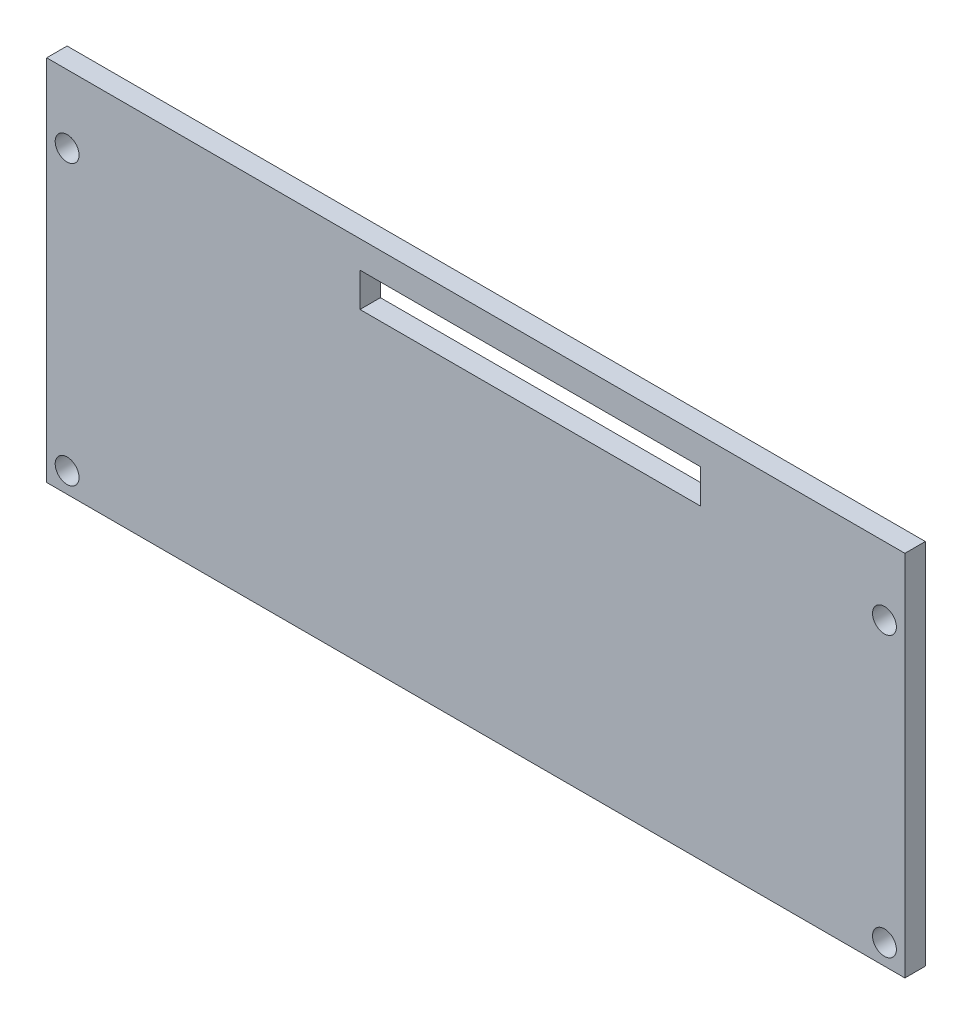
ISO-10303-21;
HEADER;
FILE_DESCRIPTION(('STEP AP214'),'2;1');
FILE_NAME('part.step','',(''),(''),'','','');
FILE_SCHEMA(('AUTOMOTIVE_DESIGN { 1 0 10303 214 1 1 1 1 }'));
ENDSEC;
DATA;
#1=APPLICATION_CONTEXT('core data for automotive mechanical design processes');
#2=APPLICATION_PROTOCOL_DEFINITION('international standard','automotive_design',2000,#1);
#3=PRODUCT_CONTEXT('',#1,'mechanical');
#4=PRODUCT('Part','Part','',(#3));
#5=PRODUCT_RELATED_PRODUCT_CATEGORY('part','',(#4));
#6=PRODUCT_DEFINITION_FORMATION('','',#4);
#7=PRODUCT_DEFINITION_CONTEXT('part definition',#1,'design');
#8=PRODUCT_DEFINITION('design','',#6,#7);
#9=PRODUCT_DEFINITION_SHAPE('','',#8);
#10=(LENGTH_UNIT() NAMED_UNIT(*) SI_UNIT(.MILLI.,.METRE.));
#11=(NAMED_UNIT(*) PLANE_ANGLE_UNIT() SI_UNIT($,.RADIAN.));
#12=(NAMED_UNIT(*) SI_UNIT($,.STERADIAN.) SOLID_ANGLE_UNIT());
#13=UNCERTAINTY_MEASURE_WITH_UNIT(LENGTH_MEASURE(1.E-05),#10,'distance_accuracy_value','');
#14=(GEOMETRIC_REPRESENTATION_CONTEXT(3) GLOBAL_UNCERTAINTY_ASSIGNED_CONTEXT((#13)) GLOBAL_UNIT_ASSIGNED_CONTEXT((#10,
#11,#12)) REPRESENTATION_CONTEXT('',''));
#15=CARTESIAN_POINT('',(0.,0.,0.));
#16=DIRECTION('',(0.,0.,1.));
#17=DIRECTION('',(1.,0.,0.));
#18=AXIS2_PLACEMENT_3D('',#15,#16,#17);
#19=CARTESIAN_POINT('',(0.,21.,3.));
#20=DIRECTION('',(0.,1.,0.));
#21=DIRECTION('',(0.,0.,1.));
#22=AXIS2_PLACEMENT_3D('',#19,#20,#21);
#23=PLANE('',#22);
#24=DIRECTION('',(1.,0.,0.));
#25=VECTOR('',#24,1.);
#26=CARTESIAN_POINT('',(0.,21.,0.));
#27=LINE('',#26,#25);
#28=CARTESIAN_POINT('',(-17.,21.,0.));
#29=VERTEX_POINT('',#28);
#30=CARTESIAN_POINT('',(33.,21.,0.));
#31=VERTEX_POINT('',#30);
#32=EDGE_CURVE('E180',#29,#31,#27,.T.);
#33=ORIENTED_EDGE('',*,*,#32,.T.);
#34=DIRECTION('',(0.,0.,-1.));
#35=VECTOR('',#34,1.);
#36=CARTESIAN_POINT('',(33.,21.,3.));
#37=LINE('',#36,#35);
#38=CARTESIAN_POINT('',(33.,21.,3.));
#39=VERTEX_POINT('',#38);
#40=EDGE_CURVE('E11',#39,#31,#37,.T.);
#41=ORIENTED_EDGE('',*,*,#40,.F.);
#42=DIRECTION('',(1.,0.,0.));
#43=VECTOR('',#42,1.);
#44=CARTESIAN_POINT('',(0.,21.,3.));
#45=LINE('',#44,#43);
#46=CARTESIAN_POINT('',(-17.,21.,3.));
#47=VERTEX_POINT('',#46);
#48=EDGE_CURVE('E127',#47,#39,#45,.T.);
#49=ORIENTED_EDGE('',*,*,#48,.F.);
#50=DIRECTION('',(0.,0.,-1.));
#51=VECTOR('',#50,1.);
#52=CARTESIAN_POINT('',(-17.,21.,3.));
#53=LINE('',#52,#51);
#54=EDGE_CURVE('E67',#47,#29,#53,.T.);
#55=ORIENTED_EDGE('',*,*,#54,.T.);
#56=EDGE_LOOP('',(#33,#41,#49,#55));
#57=FACE_BOUND('',#56,.T.);
#58=ADVANCED_FACE('F47',(#57),#23,.F.);
#59=CARTESIAN_POINT('',(33.,0.,3.));
#60=DIRECTION('',(1.,0.,0.));
#61=DIRECTION('',(0.,0.,-1.));
#62=AXIS2_PLACEMENT_3D('',#59,#60,#61);
#63=PLANE('',#62);
#64=DIRECTION('',(0.,-1.,0.));
#65=VECTOR('',#64,1.);
#66=CARTESIAN_POINT('',(33.,0.,0.));
#67=LINE('',#66,#65);
#68=CARTESIAN_POINT('',(33.,16.,0.));
#69=VERTEX_POINT('',#68);
#70=EDGE_CURVE('E134',#31,#69,#67,.T.);
#71=ORIENTED_EDGE('',*,*,#70,.T.);
#72=DIRECTION('',(0.,0.,-1.));
#73=VECTOR('',#72,1.);
#74=CARTESIAN_POINT('',(33.,16.,3.));
#75=LINE('',#74,#73);
#76=CARTESIAN_POINT('',(33.,16.,3.));
#77=VERTEX_POINT('',#76);
#78=EDGE_CURVE('E58',#77,#69,#75,.T.);
#79=ORIENTED_EDGE('',*,*,#78,.F.);
#80=DIRECTION('',(0.,-1.,0.));
#81=VECTOR('',#80,1.);
#82=CARTESIAN_POINT('',(33.,0.,3.));
#83=LINE('',#82,#81);
#84=EDGE_CURVE('E121',#39,#77,#83,.T.);
#85=ORIENTED_EDGE('',*,*,#84,.F.);
#86=ORIENTED_EDGE('',*,*,#40,.T.);
#87=EDGE_LOOP('',(#71,#79,#85,#86));
#88=FACE_BOUND('',#87,.T.);
#89=ADVANCED_FACE('F133',(#88),#63,.F.);
#90=CARTESIAN_POINT('',(0.,16.,3.));
#91=DIRECTION('',(0.,1.,0.));
#92=DIRECTION('',(0.,0.,1.));
#93=AXIS2_PLACEMENT_3D('',#90,#91,#92);
#94=PLANE('',#93);
#95=DIRECTION('',(1.,0.,0.));
#96=VECTOR('',#95,1.);
#97=CARTESIAN_POINT('',(0.,16.,0.));
#98=LINE('',#97,#96);
#99=CARTESIAN_POINT('',(-17.,16.,0.));
#100=VERTEX_POINT('',#99);
#101=EDGE_CURVE('E185',#100,#69,#98,.T.);
#102=ORIENTED_EDGE('',*,*,#101,.F.);
#103=DIRECTION('',(0.,0.,-1.));
#104=VECTOR('',#103,1.);
#105=CARTESIAN_POINT('',(-17.,16.,3.));
#106=LINE('',#105,#104);
#107=CARTESIAN_POINT('',(-17.,16.,3.));
#108=VERTEX_POINT('',#107);
#109=EDGE_CURVE('E93',#108,#100,#106,.T.);
#110=ORIENTED_EDGE('',*,*,#109,.F.);
#111=DIRECTION('',(1.,0.,0.));
#112=VECTOR('',#111,1.);
#113=CARTESIAN_POINT('',(0.,16.,3.));
#114=LINE('',#113,#112);
#115=EDGE_CURVE('E126',#108,#77,#114,.T.);
#116=ORIENTED_EDGE('',*,*,#115,.T.);
#117=ORIENTED_EDGE('',*,*,#78,.T.);
#118=EDGE_LOOP('',(#102,#110,#116,#117));
#119=FACE_BOUND('',#118,.T.);
#120=ADVANCED_FACE('F139',(#119),#94,.T.);
#121=CARTESIAN_POINT('',(63.,0.,3.));
#122=DIRECTION('',(1.,0.,0.));
#123=DIRECTION('',(0.,0.,-1.));
#124=AXIS2_PLACEMENT_3D('',#121,#122,#123);
#125=PLANE('',#124);
#126=DIRECTION('',(0.,-1.,0.));
#127=VECTOR('',#126,1.);
#128=CARTESIAN_POINT('',(63.,0.,0.));
#129=LINE('',#128,#127);
#130=CARTESIAN_POINT('',(63.,25.,0.));
#131=VERTEX_POINT('',#130);
#132=CARTESIAN_POINT('',(63.,-29.,0.));
#133=VERTEX_POINT('',#132);
#134=EDGE_CURVE('E164',#131,#133,#129,.T.);
#135=ORIENTED_EDGE('',*,*,#134,.F.);
#136=DIRECTION('',(0.,0.,-1.));
#137=VECTOR('',#136,1.);
#138=CARTESIAN_POINT('',(63.,25.,3.));
#139=LINE('',#138,#137);
#140=CARTESIAN_POINT('',(63.,25.,3.));
#141=VERTEX_POINT('',#140);
#142=EDGE_CURVE('E51',#141,#131,#139,.T.);
#143=ORIENTED_EDGE('',*,*,#142,.F.);
#144=DIRECTION('',(0.,-1.,0.));
#145=VECTOR('',#144,1.);
#146=CARTESIAN_POINT('',(63.,0.,3.));
#147=LINE('',#146,#145);
#148=CARTESIAN_POINT('',(63.,-29.,3.));
#149=VERTEX_POINT('',#148);
#150=EDGE_CURVE('E232',#141,#149,#147,.T.);
#151=ORIENTED_EDGE('',*,*,#150,.T.);
#152=DIRECTION('',(0.,0.,-1.));
#153=VECTOR('',#152,1.);
#154=CARTESIAN_POINT('',(63.,-29.,3.));
#155=LINE('',#154,#153);
#156=EDGE_CURVE('E144',#149,#133,#155,.T.);
#157=ORIENTED_EDGE('',*,*,#156,.T.);
#158=EDGE_LOOP('',(#135,#143,#151,#157));
#159=FACE_BOUND('',#158,.T.);
#160=ADVANCED_FACE('F214',(#159),#125,.T.);
#161=CARTESIAN_POINT('',(0.,25.,3.));
#162=DIRECTION('',(0.,1.,0.));
#163=DIRECTION('',(0.,0.,1.));
#164=AXIS2_PLACEMENT_3D('',#161,#162,#163);
#165=PLANE('',#164);
#166=DIRECTION('',(1.,0.,0.));
#167=VECTOR('',#166,1.);
#168=CARTESIAN_POINT('',(0.,25.,0.));
#169=LINE('',#168,#167);
#170=CARTESIAN_POINT('',(-63.,25.,0.));
#171=VERTEX_POINT('',#170);
#172=EDGE_CURVE('E168',#171,#131,#169,.T.);
#173=ORIENTED_EDGE('',*,*,#172,.F.);
#174=DIRECTION('',(0.,0.,-1.));
#175=VECTOR('',#174,1.);
#176=CARTESIAN_POINT('',(-63.,25.,3.));
#177=LINE('',#176,#175);
#178=CARTESIAN_POINT('',(-63.,25.,3.));
#179=VERTEX_POINT('',#178);
#180=EDGE_CURVE('E202',#179,#171,#177,.T.);
#181=ORIENTED_EDGE('',*,*,#180,.F.);
#182=DIRECTION('',(1.,0.,0.));
#183=VECTOR('',#182,1.);
#184=CARTESIAN_POINT('',(0.,25.,3.));
#185=LINE('',#184,#183);
#186=EDGE_CURVE('E213',#179,#141,#185,.T.);
#187=ORIENTED_EDGE('',*,*,#186,.T.);
#188=ORIENTED_EDGE('',*,*,#142,.T.);
#189=EDGE_LOOP('',(#173,#181,#187,#188));
#190=FACE_BOUND('',#189,.T.);
#191=ADVANCED_FACE('F211',(#190),#165,.T.);
#192=CARTESIAN_POINT('',(-63.,0.,3.));
#193=DIRECTION('',(1.,0.,0.));
#194=DIRECTION('',(0.,0.,-1.));
#195=AXIS2_PLACEMENT_3D('',#192,#193,#194);
#196=PLANE('',#195);
#197=DIRECTION('',(0.,-1.,0.));
#198=VECTOR('',#197,1.);
#199=CARTESIAN_POINT('',(-63.,0.,0.));
#200=LINE('',#199,#198);
#201=CARTESIAN_POINT('',(-63.,-29.,0.));
#202=VERTEX_POINT('',#201);
#203=EDGE_CURVE('E172',#171,#202,#200,.T.);
#204=ORIENTED_EDGE('',*,*,#203,.T.);
#205=DIRECTION('',(0.,0.,-1.));
#206=VECTOR('',#205,1.);
#207=CARTESIAN_POINT('',(-63.,-29.,3.));
#208=LINE('',#207,#206);
#209=CARTESIAN_POINT('',(-63.,-29.,3.));
#210=VERTEX_POINT('',#209);
#211=EDGE_CURVE('E199',#210,#202,#208,.T.);
#212=ORIENTED_EDGE('',*,*,#211,.F.);
#213=DIRECTION('',(0.,-1.,0.));
#214=VECTOR('',#213,1.);
#215=CARTESIAN_POINT('',(-63.,0.,3.));
#216=LINE('',#215,#214);
#217=EDGE_CURVE('E222',#179,#210,#216,.T.);
#218=ORIENTED_EDGE('',*,*,#217,.F.);
#219=ORIENTED_EDGE('',*,*,#180,.T.);
#220=EDGE_LOOP('',(#204,#212,#218,#219));
#221=FACE_BOUND('',#220,.T.);
#222=ADVANCED_FACE('F220',(#221),#196,.F.);
#223=CARTESIAN_POINT('',(0.,-29.,3.));
#224=DIRECTION('',(0.,1.,0.));
#225=DIRECTION('',(-1.,0.,0.));
#226=AXIS2_PLACEMENT_3D('',#223,#224,#225);
#227=PLANE('',#226);
#228=DIRECTION('',(1.,0.,0.));
#229=VECTOR('',#228,1.);
#230=CARTESIAN_POINT('',(0.,-29.,0.));
#231=LINE('',#230,#229);
#232=EDGE_CURVE('E176',#202,#133,#231,.T.);
#233=ORIENTED_EDGE('',*,*,#232,.T.);
#234=ORIENTED_EDGE('',*,*,#156,.F.);
#235=DIRECTION('',(1.,0.,0.));
#236=VECTOR('',#235,1.);
#237=CARTESIAN_POINT('',(0.,-29.,3.));
#238=LINE('',#237,#236);
#239=EDGE_CURVE('E225',#210,#149,#238,.T.);
#240=ORIENTED_EDGE('',*,*,#239,.F.);
#241=ORIENTED_EDGE('',*,*,#211,.T.);
#242=EDGE_LOOP('',(#233,#234,#240,#241));
#243=FACE_BOUND('',#242,.T.);
#244=ADVANCED_FACE('F224',(#243),#227,.F.);
#245=CARTESIAN_POINT('',(-60.,15.,3.));
#246=DIRECTION('',(0.,0.,-1.));
#247=DIRECTION('',(-1.,0.,0.));
#248=AXIS2_PLACEMENT_3D('',#245,#246,#247);
#249=CYLINDRICAL_SURFACE('',#248,1.75);
#250=CARTESIAN_POINT('',(-60.,15.,3.));
#251=DIRECTION('',(0.,0.,1.));
#252=DIRECTION('',(1.,0.,0.));
#253=AXIS2_PLACEMENT_3D('',#250,#251,#252);
#254=CIRCLE('',#253,1.75);
#255=CARTESIAN_POINT('',(-58.25,15.,3.));
#256=VERTEX_POINT('',#255);
#257=EDGE_CURVE('E238',#256,#256,#254,.T.);
#258=ORIENTED_EDGE('',*,*,#257,.T.);
#259=EDGE_LOOP('',(#258));
#260=FACE_BOUND('',#259,.T.);
#261=CARTESIAN_POINT('',(-60.,15.,0.));
#262=DIRECTION('',(0.,0.,1.));
#263=DIRECTION('',(1.,0.,0.));
#264=AXIS2_PLACEMENT_3D('',#261,#262,#263);
#265=CIRCLE('',#264,1.75);
#266=CARTESIAN_POINT('',(-58.25,15.,0.));
#267=VERTEX_POINT('',#266);
#268=EDGE_CURVE('E160',#267,#267,#265,.T.);
#269=ORIENTED_EDGE('',*,*,#268,.F.);
#270=EDGE_LOOP('',(#269));
#271=FACE_BOUND('',#270,.T.);
#272=ADVANCED_FACE('F266',(#260,#271),#249,.F.);
#273=CARTESIAN_POINT('',(60.,15.,3.));
#274=DIRECTION('',(0.,0.,-1.));
#275=DIRECTION('',(-1.,0.,0.));
#276=AXIS2_PLACEMENT_3D('',#273,#274,#275);
#277=CYLINDRICAL_SURFACE('',#276,1.75);
#278=CARTESIAN_POINT('',(60.,15.,3.));
#279=DIRECTION('',(0.,0.,1.));
#280=DIRECTION('',(1.,0.,0.));
#281=AXIS2_PLACEMENT_3D('',#278,#279,#280);
#282=CIRCLE('',#281,1.75);
#283=CARTESIAN_POINT('',(61.75,15.,3.));
#284=VERTEX_POINT('',#283);
#285=EDGE_CURVE('E242',#284,#284,#282,.T.);
#286=ORIENTED_EDGE('',*,*,#285,.T.);
#287=EDGE_LOOP('',(#286));
#288=FACE_BOUND('',#287,.T.);
#289=CARTESIAN_POINT('',(60.,15.,0.));
#290=DIRECTION('',(0.,0.,1.));
#291=DIRECTION('',(1.,0.,0.));
#292=AXIS2_PLACEMENT_3D('',#289,#290,#291);
#293=CIRCLE('',#292,1.75);
#294=CARTESIAN_POINT('',(61.75,15.,0.));
#295=VERTEX_POINT('',#294);
#296=EDGE_CURVE('E156',#295,#295,#293,.T.);
#297=ORIENTED_EDGE('',*,*,#296,.F.);
#298=EDGE_LOOP('',(#297));
#299=FACE_BOUND('',#298,.T.);
#300=ADVANCED_FACE('F269',(#288,#299),#277,.F.);
#301=CARTESIAN_POINT('',(60.0000000000004,-26.,3.));
#302=DIRECTION('',(0.,0.,-1.));
#303=DIRECTION('',(-1.,0.,0.));
#304=AXIS2_PLACEMENT_3D('',#301,#302,#303);
#305=CYLINDRICAL_SURFACE('',#304,1.75);
#306=CARTESIAN_POINT('',(60.0000000000004,-26.,3.));
#307=DIRECTION('',(0.,0.,1.));
#308=DIRECTION('',(1.,0.,0.));
#309=AXIS2_PLACEMENT_3D('',#306,#307,#308);
#310=CIRCLE('',#309,1.75);
#311=CARTESIAN_POINT('',(61.7500000000004,-26.,3.));
#312=VERTEX_POINT('',#311);
#313=EDGE_CURVE('E246',#312,#312,#310,.T.);
#314=ORIENTED_EDGE('',*,*,#313,.T.);
#315=EDGE_LOOP('',(#314));
#316=FACE_BOUND('',#315,.T.);
#317=CARTESIAN_POINT('',(60.0000000000004,-26.,0.));
#318=DIRECTION('',(0.,0.,1.));
#319=DIRECTION('',(1.,0.,0.));
#320=AXIS2_PLACEMENT_3D('',#317,#318,#319);
#321=CIRCLE('',#320,1.75);
#322=CARTESIAN_POINT('',(61.7500000000004,-26.,0.));
#323=VERTEX_POINT('',#322);
#324=EDGE_CURVE('E152',#323,#323,#321,.T.);
#325=ORIENTED_EDGE('',*,*,#324,.F.);
#326=EDGE_LOOP('',(#325));
#327=FACE_BOUND('',#326,.T.);
#328=ADVANCED_FACE('F297',(#316,#327),#305,.F.);
#329=CARTESIAN_POINT('',(-59.9999999999996,-26.,3.));
#330=DIRECTION('',(0.,0.,-1.));
#331=DIRECTION('',(-1.,0.,0.));
#332=AXIS2_PLACEMENT_3D('',#329,#330,#331);
#333=CYLINDRICAL_SURFACE('',#332,1.75);
#334=CARTESIAN_POINT('',(-59.9999999999996,-26.,3.));
#335=DIRECTION('',(0.,0.,1.));
#336=DIRECTION('',(1.,0.,0.));
#337=AXIS2_PLACEMENT_3D('',#334,#335,#336);
#338=CIRCLE('',#337,1.75);
#339=CARTESIAN_POINT('',(-58.2499999999996,-26.,3.));
#340=VERTEX_POINT('',#339);
#341=EDGE_CURVE('E192',#340,#340,#338,.T.);
#342=ORIENTED_EDGE('',*,*,#341,.T.);
#343=EDGE_LOOP('',(#342));
#344=FACE_BOUND('',#343,.T.);
#345=CARTESIAN_POINT('',(-59.9999999999996,-26.,0.));
#346=DIRECTION('',(0.,0.,1.));
#347=DIRECTION('',(1.,0.,0.));
#348=AXIS2_PLACEMENT_3D('',#345,#346,#347);
#349=CIRCLE('',#348,1.75);
#350=CARTESIAN_POINT('',(-58.2499999999996,-26.,0.));
#351=VERTEX_POINT('',#350);
#352=EDGE_CURVE('E148',#351,#351,#349,.T.);
#353=ORIENTED_EDGE('',*,*,#352,.F.);
#354=EDGE_LOOP('',(#353));
#355=FACE_BOUND('',#354,.T.);
#356=ADVANCED_FACE('F49',(#344,#355),#333,.F.);
#357=CARTESIAN_POINT('',(-17.,0.,3.));
#358=DIRECTION('',(1.,0.,0.));
#359=DIRECTION('',(0.,0.,-1.));
#360=AXIS2_PLACEMENT_3D('',#357,#358,#359);
#361=PLANE('',#360);
#362=DIRECTION('',(0.,-1.,0.));
#363=VECTOR('',#362,1.);
#364=CARTESIAN_POINT('',(-17.,0.,0.));
#365=LINE('',#364,#363);
#366=EDGE_CURVE('E188',#29,#100,#365,.T.);
#367=ORIENTED_EDGE('',*,*,#366,.F.);
#368=ORIENTED_EDGE('',*,*,#54,.F.);
#369=DIRECTION('',(0.,-1.,0.));
#370=VECTOR('',#369,1.);
#371=CARTESIAN_POINT('',(-17.,0.,3.));
#372=LINE('',#371,#370);
#373=EDGE_CURVE('E141',#47,#108,#372,.T.);
#374=ORIENTED_EDGE('',*,*,#373,.T.);
#375=ORIENTED_EDGE('',*,*,#109,.T.);
#376=EDGE_LOOP('',(#367,#368,#374,#375));
#377=FACE_BOUND('',#376,.T.);
#378=ADVANCED_FACE('F258',(#377),#361,.T.);
#379=CARTESIAN_POINT('',(0.,0.,3.));
#380=DIRECTION('',(0.,0.,1.));
#381=DIRECTION('',(1.,0.,0.));
#382=AXIS2_PLACEMENT_3D('',#379,#380,#381);
#383=PLANE('',#382);
#384=ORIENTED_EDGE('',*,*,#341,.F.);
#385=EDGE_LOOP('',(#384));
#386=FACE_BOUND('',#385,.T.);
#387=ORIENTED_EDGE('',*,*,#313,.F.);
#388=EDGE_LOOP('',(#387));
#389=FACE_BOUND('',#388,.T.);
#390=ORIENTED_EDGE('',*,*,#285,.F.);
#391=EDGE_LOOP('',(#390));
#392=FACE_BOUND('',#391,.T.);
#393=ORIENTED_EDGE('',*,*,#257,.F.);
#394=EDGE_LOOP('',(#393));
#395=FACE_BOUND('',#394,.T.);
#396=ORIENTED_EDGE('',*,*,#150,.F.);
#397=ORIENTED_EDGE('',*,*,#186,.F.);
#398=ORIENTED_EDGE('',*,*,#217,.T.);
#399=ORIENTED_EDGE('',*,*,#239,.T.);
#400=EDGE_LOOP('',(#396,#397,#398,#399));
#401=FACE_BOUND('',#400,.T.);
#402=ORIENTED_EDGE('',*,*,#48,.T.);
#403=ORIENTED_EDGE('',*,*,#84,.T.);
#404=ORIENTED_EDGE('',*,*,#115,.F.);
#405=ORIENTED_EDGE('',*,*,#373,.F.);
#406=EDGE_LOOP('',(#402,#403,#404,#405));
#407=FACE_BOUND('',#406,.T.);
#408=ADVANCED_FACE('F123',(#386,#389,#392,#395,#401,#407),#383,.T.);
#409=CARTESIAN_POINT('',(0.,0.,0.));
#410=DIRECTION('',(0.,0.,1.));
#411=DIRECTION('',(1.,0.,0.));
#412=AXIS2_PLACEMENT_3D('',#409,#410,#411);
#413=PLANE('',#412);
#414=ORIENTED_EDGE('',*,*,#352,.T.);
#415=EDGE_LOOP('',(#414));
#416=FACE_BOUND('',#415,.T.);
#417=ORIENTED_EDGE('',*,*,#324,.T.);
#418=EDGE_LOOP('',(#417));
#419=FACE_BOUND('',#418,.T.);
#420=ORIENTED_EDGE('',*,*,#296,.T.);
#421=EDGE_LOOP('',(#420));
#422=FACE_BOUND('',#421,.T.);
#423=ORIENTED_EDGE('',*,*,#268,.T.);
#424=EDGE_LOOP('',(#423));
#425=FACE_BOUND('',#424,.T.);
#426=ORIENTED_EDGE('',*,*,#134,.T.);
#427=ORIENTED_EDGE('',*,*,#232,.F.);
#428=ORIENTED_EDGE('',*,*,#203,.F.);
#429=ORIENTED_EDGE('',*,*,#172,.T.);
#430=EDGE_LOOP('',(#426,#427,#428,#429));
#431=FACE_BOUND('',#430,.T.);
#432=ORIENTED_EDGE('',*,*,#32,.F.);
#433=ORIENTED_EDGE('',*,*,#366,.T.);
#434=ORIENTED_EDGE('',*,*,#101,.T.);
#435=ORIENTED_EDGE('',*,*,#70,.F.);
#436=EDGE_LOOP('',(#432,#433,#434,#435));
#437=FACE_BOUND('',#436,.T.);
#438=ADVANCED_FACE('F217',(#416,#419,#422,#425,#431,#437),#413,.F.);
#439=CLOSED_SHELL('',(#58,#89,#120,#160,#191,#222,#244,#272,#300,#328,#356,#378,#408,#438));
#440=MANIFOLD_SOLID_BREP('B2',#439);
#441=ADVANCED_BREP_SHAPE_REPRESENTATION('',(#18,#440),#14);
#442=SHAPE_DEFINITION_REPRESENTATION(#9,#441);
ENDSEC;
END-ISO-10303-21;
